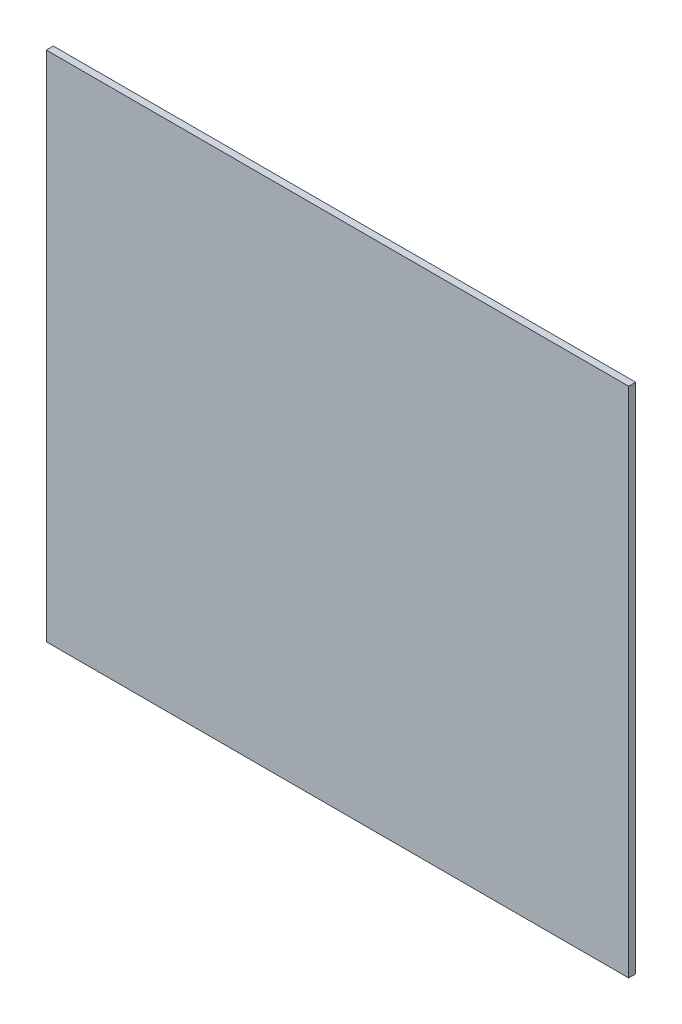
ISO-10303-21;
HEADER;
FILE_DESCRIPTION(('STEP AP214'),'2;1');
FILE_NAME('part.step','',(''),(''),'','','');
FILE_SCHEMA(('AUTOMOTIVE_DESIGN { 1 0 10303 214 1 1 1 1 }'));
ENDSEC;
DATA;
#1=APPLICATION_CONTEXT('core data for automotive mechanical design processes');
#2=APPLICATION_PROTOCOL_DEFINITION('international standard','automotive_design',2000,#1);
#3=PRODUCT_CONTEXT('',#1,'mechanical');
#4=PRODUCT('Part','Part','',(#3));
#5=PRODUCT_RELATED_PRODUCT_CATEGORY('part','',(#4));
#6=PRODUCT_DEFINITION_FORMATION('','',#4);
#7=PRODUCT_DEFINITION_CONTEXT('part definition',#1,'design');
#8=PRODUCT_DEFINITION('design','',#6,#7);
#9=PRODUCT_DEFINITION_SHAPE('','',#8);
#10=(LENGTH_UNIT() NAMED_UNIT(*) SI_UNIT(.MILLI.,.METRE.));
#11=(NAMED_UNIT(*) PLANE_ANGLE_UNIT() SI_UNIT($,.RADIAN.));
#12=(NAMED_UNIT(*) SI_UNIT($,.STERADIAN.) SOLID_ANGLE_UNIT());
#13=UNCERTAINTY_MEASURE_WITH_UNIT(LENGTH_MEASURE(1.E-05),#10,'distance_accuracy_value','');
#14=(GEOMETRIC_REPRESENTATION_CONTEXT(3) GLOBAL_UNCERTAINTY_ASSIGNED_CONTEXT((#13)) GLOBAL_UNIT_ASSIGNED_CONTEXT((#10,
#11,#12)) REPRESENTATION_CONTEXT('',''));
#15=CARTESIAN_POINT('',(0.,0.,0.));
#16=DIRECTION('',(0.,0.,1.));
#17=DIRECTION('',(1.,0.,0.));
#18=AXIS2_PLACEMENT_3D('',#15,#16,#17);
#19=CARTESIAN_POINT('',(-89.5388421744983,189.854863969112,3.));
#20=DIRECTION('',(1.,0.,0.));
#21=DIRECTION('',(0.,0.,-1.));
#22=AXIS2_PLACEMENT_3D('',#19,#20,#21);
#23=PLANE('',#22);
#24=DIRECTION('',(0.,-1.,0.));
#25=VECTOR('',#24,1.);
#26=CARTESIAN_POINT('',(-89.5388421744983,189.854863969112,0.));
#27=LINE('',#26,#25);
#28=CARTESIAN_POINT('',(-89.5388421744983,189.854863969112,0.));
#29=VERTEX_POINT('',#28);
#30=CARTESIAN_POINT('',(-89.5388421744983,-30.145136030888,0.));
#31=VERTEX_POINT('',#30);
#32=EDGE_CURVE('E203',#29,#31,#27,.T.);
#33=ORIENTED_EDGE('',*,*,#32,.T.);
#34=DIRECTION('',(0.,0.,-1.));
#35=VECTOR('',#34,1.);
#36=CARTESIAN_POINT('',(-89.5388421744983,-30.145136030888,3.));
#37=LINE('',#36,#35);
#38=CARTESIAN_POINT('',(-89.5388421744983,-30.145136030888,3.));
#39=VERTEX_POINT('',#38);
#40=EDGE_CURVE('E232',#39,#31,#37,.T.);
#41=ORIENTED_EDGE('',*,*,#40,.F.);
#42=DIRECTION('',(0.,-1.,0.));
#43=VECTOR('',#42,1.);
#44=CARTESIAN_POINT('',(-89.5388421744983,189.854863969112,3.));
#45=LINE('',#44,#43);
#46=CARTESIAN_POINT('',(-89.5388421744983,189.854863969112,3.));
#47=VERTEX_POINT('',#46);
#48=EDGE_CURVE('E206',#47,#39,#45,.T.);
#49=ORIENTED_EDGE('',*,*,#48,.F.);
#50=DIRECTION('',(0.,0.,-1.));
#51=VECTOR('',#50,1.);
#52=CARTESIAN_POINT('',(-89.5388421744983,189.854863969112,3.));
#53=LINE('',#52,#51);
#54=EDGE_CURVE('E216',#47,#29,#53,.T.);
#55=ORIENTED_EDGE('',*,*,#54,.T.);
#56=EDGE_LOOP('',(#33,#41,#49,#55));
#57=FACE_BOUND('',#56,.T.);
#58=ADVANCED_FACE('F63',(#57),#23,.F.);
#59=CARTESIAN_POINT('',(-89.5388421744983,-30.145136030888,3.));
#60=DIRECTION('',(0.,1.,0.));
#61=DIRECTION('',(0.,0.,1.));
#62=AXIS2_PLACEMENT_3D('',#59,#60,#61);
#63=PLANE('',#62);
#64=DIRECTION('',(1.,0.,0.));
#65=VECTOR('',#64,1.);
#66=CARTESIAN_POINT('',(-89.5388421744983,-30.145136030888,0.));
#67=LINE('',#66,#65);
#68=CARTESIAN_POINT('',(160.461157825502,-30.145136030888,0.));
#69=VERTEX_POINT('',#68);
#70=EDGE_CURVE('E219',#31,#69,#67,.T.);
#71=ORIENTED_EDGE('',*,*,#70,.T.);
#72=DIRECTION('',(0.,0.,-1.));
#73=VECTOR('',#72,1.);
#74=CARTESIAN_POINT('',(160.461157825502,-30.145136030888,3.));
#75=LINE('',#74,#73);
#76=CARTESIAN_POINT('',(160.461157825502,-30.145136030888,3.));
#77=VERTEX_POINT('',#76);
#78=EDGE_CURVE('E229',#77,#69,#75,.T.);
#79=ORIENTED_EDGE('',*,*,#78,.F.);
#80=DIRECTION('',(1.,0.,0.));
#81=VECTOR('',#80,1.);
#82=CARTESIAN_POINT('',(-89.5388421744983,-30.145136030888,3.));
#83=LINE('',#82,#81);
#84=EDGE_CURVE('E209',#39,#77,#83,.T.);
#85=ORIENTED_EDGE('',*,*,#84,.F.);
#86=ORIENTED_EDGE('',*,*,#40,.T.);
#87=EDGE_LOOP('',(#71,#79,#85,#86));
#88=FACE_BOUND('',#87,.T.);
#89=ADVANCED_FACE('F272',(#88),#63,.F.);
#90=CARTESIAN_POINT('',(160.461157825502,189.854863969112,3.));
#91=DIRECTION('',(-1.,0.,0.));
#92=DIRECTION('',(0.,0.,1.));
#93=AXIS2_PLACEMENT_3D('',#90,#91,#92);
#94=PLANE('',#93);
#95=DIRECTION('',(0.,1.,0.));
#96=VECTOR('',#95,1.);
#97=CARTESIAN_POINT('',(160.461157825502,189.854863969112,0.));
#98=LINE('',#97,#96);
#99=CARTESIAN_POINT('',(160.461157825502,189.854863969112,0.));
#100=VERTEX_POINT('',#99);
#101=EDGE_CURVE('E221',#69,#100,#98,.T.);
#102=ORIENTED_EDGE('',*,*,#101,.T.);
#103=DIRECTION('',(0.,0.,-1.));
#104=VECTOR('',#103,1.);
#105=CARTESIAN_POINT('',(160.461157825502,189.854863969112,3.));
#106=LINE('',#105,#104);
#107=CARTESIAN_POINT('',(160.461157825502,189.854863969112,3.));
#108=VERTEX_POINT('',#107);
#109=EDGE_CURVE('E226',#108,#100,#106,.T.);
#110=ORIENTED_EDGE('',*,*,#109,.F.);
#111=DIRECTION('',(0.,1.,0.));
#112=VECTOR('',#111,1.);
#113=CARTESIAN_POINT('',(160.461157825502,189.854863969112,3.));
#114=LINE('',#113,#112);
#115=EDGE_CURVE('E212',#77,#108,#114,.T.);
#116=ORIENTED_EDGE('',*,*,#115,.F.);
#117=ORIENTED_EDGE('',*,*,#78,.T.);
#118=EDGE_LOOP('',(#102,#110,#116,#117));
#119=FACE_BOUND('',#118,.T.);
#120=ADVANCED_FACE('F277',(#119),#94,.F.);
#121=CARTESIAN_POINT('',(-89.5388421744983,189.854863969112,3.));
#122=DIRECTION('',(0.,-1.,0.));
#123=DIRECTION('',(0.,0.,-1.));
#124=AXIS2_PLACEMENT_3D('',#121,#122,#123);
#125=PLANE('',#124);
#126=DIRECTION('',(-1.,0.,0.));
#127=VECTOR('',#126,1.);
#128=CARTESIAN_POINT('',(-89.5388421744983,189.854863969112,0.));
#129=LINE('',#128,#127);
#130=EDGE_CURVE('E210',#100,#29,#129,.T.);
#131=ORIENTED_EDGE('',*,*,#130,.T.);
#132=ORIENTED_EDGE('',*,*,#54,.F.);
#133=DIRECTION('',(-1.,0.,0.));
#134=VECTOR('',#133,1.);
#135=CARTESIAN_POINT('',(-89.5388421744983,189.854863969112,3.));
#136=LINE('',#135,#134);
#137=EDGE_CURVE('E214',#108,#47,#136,.T.);
#138=ORIENTED_EDGE('',*,*,#137,.F.);
#139=ORIENTED_EDGE('',*,*,#109,.T.);
#140=EDGE_LOOP('',(#131,#132,#138,#139));
#141=FACE_BOUND('',#140,.T.);
#142=ADVANCED_FACE('F292',(#141),#125,.F.);
#143=CARTESIAN_POINT('',(0.,0.,3.));
#144=DIRECTION('',(0.,0.,1.));
#145=DIRECTION('',(1.,0.,0.));
#146=AXIS2_PLACEMENT_3D('',#143,#144,#145);
#147=PLANE('',#146);
#148=ORIENTED_EDGE('',*,*,#48,.T.);
#149=ORIENTED_EDGE('',*,*,#84,.T.);
#150=ORIENTED_EDGE('',*,*,#115,.T.);
#151=ORIENTED_EDGE('',*,*,#137,.T.);
#152=EDGE_LOOP('',(#148,#149,#150,#151));
#153=FACE_BOUND('',#152,.T.);
#154=ADVANCED_FACE('F288',(#153),#147,.T.);
#155=CARTESIAN_POINT('',(0.,0.,0.));
#156=DIRECTION('',(0.,0.,1.));
#157=DIRECTION('',(1.,0.,0.));
#158=AXIS2_PLACEMENT_3D('',#155,#156,#157);
#159=PLANE('',#158);
#160=DIRECTION('',(0.,-1.,0.));
#161=VECTOR('',#160,1.);
#162=CARTESIAN_POINT('',(117.483851660808,131.854863969112,0.));
#163=LINE('',#162,#161);
#164=CARTESIAN_POINT('',(117.483851660808,131.854863969112,0.));
#165=VERTEX_POINT('',#164);
#166=CARTESIAN_POINT('',(117.483851660808,129.854863969112,0.));
#167=VERTEX_POINT('',#166);
#168=EDGE_CURVE('E162',#165,#167,#163,.T.);
#169=ORIENTED_EDGE('',*,*,#168,.F.);
#170=DIRECTION('',(-1.,0.,0.));
#171=VECTOR('',#170,1.);
#172=CARTESIAN_POINT('',(0.,131.854863969112,0.));
#173=LINE('',#172,#171);
#174=CARTESIAN_POINT('',(116.483578215405,131.854863969112,0.));
#175=VERTEX_POINT('',#174);
#176=EDGE_CURVE('E72',#165,#175,#173,.T.);
#177=ORIENTED_EDGE('',*,*,#176,.T.);
#178=DIRECTION('',(0.,-1.,0.));
#179=VECTOR('',#178,1.);
#180=CARTESIAN_POINT('',(116.483578215405,0.,0.));
#181=LINE('',#180,#179);
#182=CARTESIAN_POINT('',(116.483578215405,129.854863969112,0.));
#183=VERTEX_POINT('',#182);
#184=EDGE_CURVE('E237',#175,#183,#181,.T.);
#185=ORIENTED_EDGE('',*,*,#184,.T.);
#186=DIRECTION('',(-1.,0.,0.));
#187=VECTOR('',#186,1.);
#188=CARTESIAN_POINT('',(0.,129.854863969112,0.));
#189=LINE('',#188,#187);
#190=EDGE_CURVE('E235',#167,#183,#189,.T.);
#191=ORIENTED_EDGE('',*,*,#190,.F.);
#192=EDGE_LOOP('',(#169,#177,#185,#191));
#193=FACE_BOUND('',#192,.T.);
#194=DIRECTION('',(0.,1.,0.));
#195=VECTOR('',#194,1.);
#196=CARTESIAN_POINT('',(132.02137360157,0.,0.));
#197=LINE('',#196,#195);
#198=CARTESIAN_POINT('',(132.02137360157,129.854863969112,0.));
#199=VERTEX_POINT('',#198);
#200=CARTESIAN_POINT('',(132.02137360157,131.854863969112,0.));
#201=VERTEX_POINT('',#200);
#202=EDGE_CURVE('E66',#199,#201,#197,.T.);
#203=ORIENTED_EDGE('',*,*,#202,.T.);
#204=CARTESIAN_POINT('',(131.02137360157,131.854863969112,0.));
#205=VERTEX_POINT('',#204);
#206=EDGE_CURVE('E12',#201,#205,#173,.T.);
#207=ORIENTED_EDGE('',*,*,#206,.T.);
#208=DIRECTION('',(0.,-1.,0.));
#209=VECTOR('',#208,1.);
#210=CARTESIAN_POINT('',(131.02137360157,131.854863969112,0.));
#211=LINE('',#210,#209);
#212=CARTESIAN_POINT('',(131.02137360157,129.854863969112,0.));
#213=VERTEX_POINT('',#212);
#214=EDGE_CURVE('E149',#205,#213,#211,.T.);
#215=ORIENTED_EDGE('',*,*,#214,.T.);
#216=EDGE_CURVE('E82',#199,#213,#189,.T.);
#217=ORIENTED_EDGE('',*,*,#216,.F.);
#218=EDGE_LOOP('',(#203,#207,#215,#217));
#219=FACE_BOUND('',#218,.T.);
#220=ORIENTED_EDGE('',*,*,#32,.F.);
#221=ORIENTED_EDGE('',*,*,#130,.F.);
#222=ORIENTED_EDGE('',*,*,#101,.F.);
#223=ORIENTED_EDGE('',*,*,#70,.F.);
#224=EDGE_LOOP('',(#220,#221,#222,#223));
#225=FACE_BOUND('',#224,.T.);
#226=ADVANCED_FACE('F147',(#193,#219,#225),#159,.F.);
#227=CARTESIAN_POINT('',(132.02137360157,131.854863969112,0.));
#228=DIRECTION('',(1.,0.,0.));
#229=DIRECTION('',(0.,0.,-1.));
#230=AXIS2_PLACEMENT_3D('',#227,#228,#229);
#231=PLANE('',#230);
#232=ORIENTED_EDGE('',*,*,#202,.F.);
#233=DIRECTION('',(0.,0.,1.));
#234=VECTOR('',#233,1.);
#235=CARTESIAN_POINT('',(132.02137360157,129.854863969112,0.));
#236=LINE('',#235,#234);
#237=CARTESIAN_POINT('',(132.02137360157,129.854863969112,-8.23002648788465));
#238=VERTEX_POINT('',#237);
#239=EDGE_CURVE('E181',#238,#199,#236,.T.);
#240=ORIENTED_EDGE('',*,*,#239,.F.);
#241=DIRECTION('',(0.,-1.,0.));
#242=VECTOR('',#241,1.);
#243=CARTESIAN_POINT('',(132.02137360157,131.854863969112,-8.23002648788465));
#244=LINE('',#243,#242);
#245=CARTESIAN_POINT('',(132.02137360157,131.854863969112,-8.23002648788465));
#246=VERTEX_POINT('',#245);
#247=EDGE_CURVE('E201',#246,#238,#244,.T.);
#248=ORIENTED_EDGE('',*,*,#247,.F.);
#249=DIRECTION('',(0.,0.,1.));
#250=VECTOR('',#249,1.);
#251=CARTESIAN_POINT('',(132.02137360157,131.854863969112,0.));
#252=LINE('',#251,#250);
#253=EDGE_CURVE('E186',#246,#201,#252,.T.);
#254=ORIENTED_EDGE('',*,*,#253,.T.);
#255=EDGE_LOOP('',(#232,#240,#248,#254));
#256=FACE_BOUND('',#255,.T.);
#257=ADVANCED_FACE('F245',(#256),#231,.T.);
#258=CARTESIAN_POINT('',(116.419900537186,131.854863969112,-2.72274658472961));
#259=DIRECTION('',(-0.99972662934901,0.,0.0233809018317604));
#260=DIRECTION('',(0.0233809018317604,0.,0.99972662934901));
#261=AXIS2_PLACEMENT_3D('',#258,#259,#260);
#262=PLANE('',#261);
#263=ORIENTED_EDGE('',*,*,#184,.F.);
#264=DIRECTION('',(-0.0233809018317604,0.,-0.99972662934901));
#265=VECTOR('',#264,1.);
#266=CARTESIAN_POINT('',(116.419900537186,131.854863969112,-2.72274658472961));
#267=LINE('',#266,#265);
#268=CARTESIAN_POINT('',(116.291382892857,131.854863969112,-8.217937159591));
#269=VERTEX_POINT('',#268);
#270=EDGE_CURVE('E188',#175,#269,#267,.T.);
#271=ORIENTED_EDGE('',*,*,#270,.T.);
#272=DIRECTION('',(0.,-1.,0.));
#273=VECTOR('',#272,1.);
#274=CARTESIAN_POINT('',(116.291382892857,131.854863969112,-8.217937159591));
#275=LINE('',#274,#273);
#276=CARTESIAN_POINT('',(116.291382892857,129.854863969112,-8.217937159591));
#277=VERTEX_POINT('',#276);
#278=EDGE_CURVE('E194',#269,#277,#275,.T.);
#279=ORIENTED_EDGE('',*,*,#278,.T.);
#280=DIRECTION('',(-0.0233809018317604,0.,-0.99972662934901));
#281=VECTOR('',#280,1.);
#282=CARTESIAN_POINT('',(116.419900537186,129.854863969112,-2.72274658472961));
#283=LINE('',#282,#281);
#284=EDGE_CURVE('E197',#183,#277,#283,.T.);
#285=ORIENTED_EDGE('',*,*,#284,.F.);
#286=EDGE_LOOP('',(#263,#271,#279,#285));
#287=FACE_BOUND('',#286,.T.);
#288=ADVANCED_FACE('F254',(#287),#262,.T.);
#289=CARTESIAN_POINT('',(124.15637360157,131.854863969112,-8.23002648788465));
#290=DIRECTION('',(0.,1.,0.));
#291=DIRECTION('',(0.,0.,1.));
#292=AXIS2_PLACEMENT_3D('',#289,#290,#291);
#293=PLANE('',#292);
#294=ORIENTED_EDGE('',*,*,#206,.F.);
#295=ORIENTED_EDGE('',*,*,#253,.F.);
#296=CARTESIAN_POINT('',(124.15637360157,131.854863969112,-8.23002648788465));
#297=DIRECTION('',(0.,1.,0.));
#298=DIRECTION('',(1.,0.,0.));
#299=AXIS2_PLACEMENT_3D('',#296,#297,#298);
#300=CIRCLE('',#299,7.86499999999997);
#301=EDGE_CURVE('E191',#246,#269,#300,.T.);
#302=ORIENTED_EDGE('',*,*,#301,.T.);
#303=ORIENTED_EDGE('',*,*,#270,.F.);
#304=ORIENTED_EDGE('',*,*,#176,.F.);
#305=DIRECTION('',(-0.0233809018317604,0.,-0.99972662934901));
#306=VECTOR('',#305,1.);
#307=CARTESIAN_POINT('',(117.419627166535,131.854863969112,-2.74612748656137));
#308=LINE('',#307,#306);
#309=CARTESIAN_POINT('',(117.29137360157,131.854863969112,-8.23002648788465));
#310=VERTEX_POINT('',#309);
#311=EDGE_CURVE('E167',#165,#310,#308,.T.);
#312=ORIENTED_EDGE('',*,*,#311,.T.);
#313=CARTESIAN_POINT('',(124.15637360157,131.854863969112,-8.23002648788465));
#314=DIRECTION('',(0.,1.,0.));
#315=DIRECTION('',(0.,0.,1.));
#316=AXIS2_PLACEMENT_3D('',#313,#314,#315);
#317=CIRCLE('',#316,6.86499999999997);
#318=CARTESIAN_POINT('',(131.02137360157,131.854863969112,-8.23002648788465));
#319=VERTEX_POINT('',#318);
#320=EDGE_CURVE('E163',#319,#310,#317,.T.);
#321=ORIENTED_EDGE('',*,*,#320,.F.);
#322=DIRECTION('',(0.,0.,1.));
#323=VECTOR('',#322,1.);
#324=CARTESIAN_POINT('',(131.02137360157,131.854863969112,0.));
#325=LINE('',#324,#323);
#326=EDGE_CURVE('E158',#319,#205,#325,.T.);
#327=ORIENTED_EDGE('',*,*,#326,.T.);
#328=EDGE_LOOP('',(#294,#295,#302,#303,#304,#312,#321,#327));
#329=FACE_BOUND('',#328,.T.);
#330=ADVANCED_FACE('F165',(#329),#293,.T.);
#331=CARTESIAN_POINT('',(124.15637360157,129.854863969112,-8.23002648788465));
#332=DIRECTION('',(0.,1.,0.));
#333=DIRECTION('',(0.,0.,1.));
#334=AXIS2_PLACEMENT_3D('',#331,#332,#333);
#335=PLANE('',#334);
#336=ORIENTED_EDGE('',*,*,#239,.T.);
#337=ORIENTED_EDGE('',*,*,#216,.T.);
#338=DIRECTION('',(0.,0.,1.));
#339=VECTOR('',#338,1.);
#340=CARTESIAN_POINT('',(131.02137360157,129.854863969112,0.));
#341=LINE('',#340,#339);
#342=CARTESIAN_POINT('',(131.02137360157,129.854863969112,-8.23002648788465));
#343=VERTEX_POINT('',#342);
#344=EDGE_CURVE('E161',#343,#213,#341,.T.);
#345=ORIENTED_EDGE('',*,*,#344,.F.);
#346=CARTESIAN_POINT('',(124.15637360157,129.854863969112,-8.23002648788465));
#347=DIRECTION('',(0.,1.,0.));
#348=DIRECTION('',(0.,0.,1.));
#349=AXIS2_PLACEMENT_3D('',#346,#347,#348);
#350=CIRCLE('',#349,6.86499999999997);
#351=CARTESIAN_POINT('',(117.29137360157,129.854863969112,-8.23002648788465));
#352=VERTEX_POINT('',#351);
#353=EDGE_CURVE('E168',#343,#352,#350,.T.);
#354=ORIENTED_EDGE('',*,*,#353,.T.);
#355=DIRECTION('',(-0.0233809018317604,0.,-0.99972662934901));
#356=VECTOR('',#355,1.);
#357=CARTESIAN_POINT('',(117.419627166535,129.854863969112,-2.74612748656137));
#358=LINE('',#357,#356);
#359=EDGE_CURVE('E172',#167,#352,#358,.T.);
#360=ORIENTED_EDGE('',*,*,#359,.F.);
#361=ORIENTED_EDGE('',*,*,#190,.T.);
#362=ORIENTED_EDGE('',*,*,#284,.T.);
#363=CARTESIAN_POINT('',(124.15637360157,129.854863969112,-8.23002648788465));
#364=DIRECTION('',(0.,1.,0.));
#365=DIRECTION('',(1.,0.,0.));
#366=AXIS2_PLACEMENT_3D('',#363,#364,#365);
#367=CIRCLE('',#366,7.86499999999997);
#368=EDGE_CURVE('E189',#238,#277,#367,.T.);
#369=ORIENTED_EDGE('',*,*,#368,.F.);
#370=EDGE_LOOP('',(#336,#337,#345,#354,#360,#361,#362,#369));
#371=FACE_BOUND('',#370,.T.);
#372=ADVANCED_FACE('F241',(#371),#335,.F.);
#373=CARTESIAN_POINT('',(124.15637360157,131.854863969112,-8.23002648788465));
#374=DIRECTION('',(0.,-1.,0.));
#375=DIRECTION('',(0.,0.,-1.));
#376=AXIS2_PLACEMENT_3D('',#373,#374,#375);
#377=CYLINDRICAL_SURFACE('',#376,7.86499999999997);
#378=ORIENTED_EDGE('',*,*,#368,.T.);
#379=ORIENTED_EDGE('',*,*,#278,.F.);
#380=ORIENTED_EDGE('',*,*,#301,.F.);
#381=ORIENTED_EDGE('',*,*,#247,.T.);
#382=EDGE_LOOP('',(#378,#379,#380,#381));
#383=FACE_BOUND('',#382,.T.);
#384=ADVANCED_FACE('F251',(#383),#377,.T.);
#385=CARTESIAN_POINT('',(131.02137360157,131.854863969112,0.));
#386=DIRECTION('',(1.,0.,0.));
#387=DIRECTION('',(0.,0.,-1.));
#388=AXIS2_PLACEMENT_3D('',#385,#386,#387);
#389=PLANE('',#388);
#390=ORIENTED_EDGE('',*,*,#344,.T.);
#391=ORIENTED_EDGE('',*,*,#214,.F.);
#392=ORIENTED_EDGE('',*,*,#326,.F.);
#393=DIRECTION('',(0.,-1.,0.));
#394=VECTOR('',#393,1.);
#395=CARTESIAN_POINT('',(131.02137360157,131.854863969112,-8.23002648788465));
#396=LINE('',#395,#394);
#397=EDGE_CURVE('E179',#319,#343,#396,.T.);
#398=ORIENTED_EDGE('',*,*,#397,.T.);
#399=EDGE_LOOP('',(#390,#391,#392,#398));
#400=FACE_BOUND('',#399,.T.);
#401=ADVANCED_FACE('F157',(#400),#389,.F.);
#402=CARTESIAN_POINT('',(124.15637360157,131.854863969112,-8.23002648788465));
#403=DIRECTION('',(0.,-1.,0.));
#404=DIRECTION('',(0.,0.,-1.));
#405=AXIS2_PLACEMENT_3D('',#402,#403,#404);
#406=CYLINDRICAL_SURFACE('',#405,6.86499999999997);
#407=ORIENTED_EDGE('',*,*,#353,.F.);
#408=ORIENTED_EDGE('',*,*,#397,.F.);
#409=ORIENTED_EDGE('',*,*,#320,.T.);
#410=DIRECTION('',(0.,-1.,0.));
#411=VECTOR('',#410,1.);
#412=CARTESIAN_POINT('',(117.29137360157,131.854863969112,-8.23002648788465));
#413=LINE('',#412,#411);
#414=EDGE_CURVE('E182',#310,#352,#413,.T.);
#415=ORIENTED_EDGE('',*,*,#414,.T.);
#416=EDGE_LOOP('',(#407,#408,#409,#415));
#417=FACE_BOUND('',#416,.T.);
#418=ADVANCED_FACE('F262',(#417),#406,.F.);
#419=CARTESIAN_POINT('',(117.419627166535,131.854863969112,-2.74612748656137));
#420=DIRECTION('',(-0.99972662934901,0.,0.0233809018317604));
#421=DIRECTION('',(0.0233809018317604,0.,0.99972662934901));
#422=AXIS2_PLACEMENT_3D('',#419,#420,#421);
#423=PLANE('',#422);
#424=ORIENTED_EDGE('',*,*,#359,.T.);
#425=ORIENTED_EDGE('',*,*,#414,.F.);
#426=ORIENTED_EDGE('',*,*,#311,.F.);
#427=ORIENTED_EDGE('',*,*,#168,.T.);
#428=EDGE_LOOP('',(#424,#425,#426,#427));
#429=FACE_BOUND('',#428,.T.);
#430=ADVANCED_FACE('F258',(#429),#423,.F.);
#431=CLOSED_SHELL('',(#58,#89,#120,#142,#154,#226,#257,#288,#330,#372,#384,#401,#418,#430));
#432=MANIFOLD_SOLID_BREP('B2',#431);
#433=ADVANCED_BREP_SHAPE_REPRESENTATION('',(#18,#432),#14);
#434=SHAPE_DEFINITION_REPRESENTATION(#9,#433);
ENDSEC;
END-ISO-10303-21;
